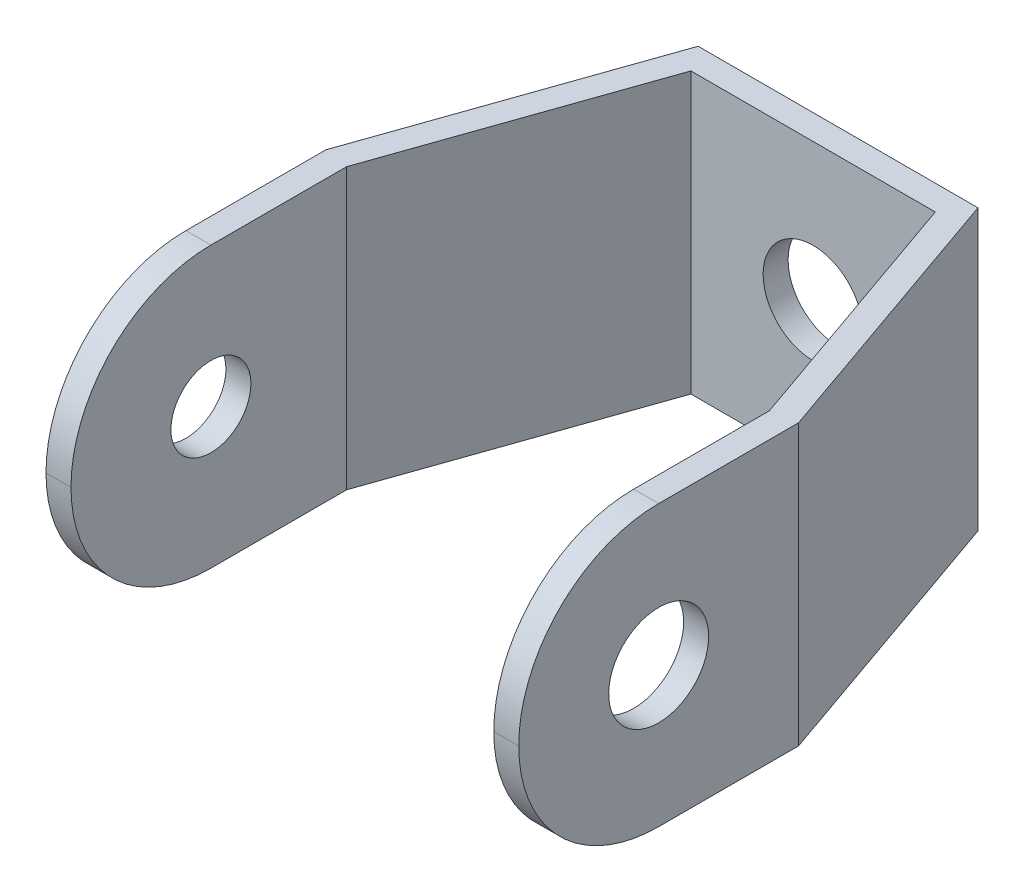
ISO-10303-21;
HEADER;
FILE_DESCRIPTION(('STEP AP214'),'2;1');
FILE_NAME('part.step','',(''),(''),'','','');
FILE_SCHEMA(('AUTOMOTIVE_DESIGN { 1 0 10303 214 1 1 1 1 }'));
ENDSEC;
DATA;
#1=APPLICATION_CONTEXT('core data for automotive mechanical design processes');
#2=APPLICATION_PROTOCOL_DEFINITION('international standard','automotive_design',2000,#1);
#3=PRODUCT_CONTEXT('',#1,'mechanical');
#4=PRODUCT('Part','Part','',(#3));
#5=PRODUCT_RELATED_PRODUCT_CATEGORY('part','',(#4));
#6=PRODUCT_DEFINITION_FORMATION('','',#4);
#7=PRODUCT_DEFINITION_CONTEXT('part definition',#1,'design');
#8=PRODUCT_DEFINITION('design','',#6,#7);
#9=PRODUCT_DEFINITION_SHAPE('','',#8);
#10=(LENGTH_UNIT() NAMED_UNIT(*) SI_UNIT(.MILLI.,.METRE.));
#11=(NAMED_UNIT(*) PLANE_ANGLE_UNIT() SI_UNIT($,.RADIAN.));
#12=(NAMED_UNIT(*) SI_UNIT($,.STERADIAN.) SOLID_ANGLE_UNIT());
#13=UNCERTAINTY_MEASURE_WITH_UNIT(LENGTH_MEASURE(1.E-05),#10,'distance_accuracy_value','');
#14=(GEOMETRIC_REPRESENTATION_CONTEXT(3) GLOBAL_UNCERTAINTY_ASSIGNED_CONTEXT((#13)) GLOBAL_UNIT_ASSIGNED_CONTEXT((#10,
#11,#12)) REPRESENTATION_CONTEXT('',''));
#15=CARTESIAN_POINT('',(0.,0.,0.));
#16=DIRECTION('',(0.,0.,1.));
#17=DIRECTION('',(1.,0.,0.));
#18=AXIS2_PLACEMENT_3D('',#15,#16,#17);
#19=CARTESIAN_POINT('',(-23.65,14.,55.6));
#20=DIRECTION('',(0.,-1.,0.));
#21=DIRECTION('',(0.,0.,-1.));
#22=AXIS2_PLACEMENT_3D('',#19,#20,#21);
#23=PLANE('',#22);
#24=DIRECTION('',(0.,0.,1.));
#25=VECTOR('',#24,1.);
#26=CARTESIAN_POINT('',(21.15,14.,0.));
#27=LINE('',#26,#25);
#28=CARTESIAN_POINT('',(21.15,14.,28.0244491600482));
#29=VERTEX_POINT('',#28);
#30=CARTESIAN_POINT('',(21.15,14.,41.6));
#31=VERTEX_POINT('',#30);
#32=EDGE_CURVE('E153',#29,#31,#27,.T.);
#33=ORIENTED_EDGE('',*,*,#32,.T.);
#34=DIRECTION('',(-1.,0.,0.));
#35=VECTOR('',#34,1.);
#36=CARTESIAN_POINT('',(23.65,14.,41.6));
#37=LINE('',#36,#35);
#38=CARTESIAN_POINT('',(23.65,14.,41.6));
#39=VERTEX_POINT('',#38);
#40=EDGE_CURVE('E11',#31,#39,#37,.F.);
#41=ORIENTED_EDGE('',*,*,#40,.T.);
#42=DIRECTION('',(0.,0.,-1.));
#43=VECTOR('',#42,1.);
#44=CARTESIAN_POINT('',(23.65,14.,55.6));
#45=LINE('',#44,#43);
#46=CARTESIAN_POINT('',(23.65,14.,27.6));
#47=VERTEX_POINT('',#46);
#48=EDGE_CURVE('E248',#39,#47,#45,.T.);
#49=ORIENTED_EDGE('',*,*,#48,.T.);
#50=DIRECTION('',(0.330045715946504,0.,0.943964949235595));
#51=VECTOR('',#50,1.);
#52=CARTESIAN_POINT('',(14.,14.,0.));
#53=LINE('',#52,#51);
#54=CARTESIAN_POINT('',(14.,14.,0.));
#55=VERTEX_POINT('',#54);
#56=EDGE_CURVE('E196',#55,#47,#53,.T.);
#57=ORIENTED_EDGE('',*,*,#56,.F.);
#58=DIRECTION('',(-1.,0.,0.));
#59=VECTOR('',#58,1.);
#60=CARTESIAN_POINT('',(-23.65,14.,0.));
#61=LINE('',#60,#59);
#62=CARTESIAN_POINT('',(-14.,14.,0.));
#63=VERTEX_POINT('',#62);
#64=EDGE_CURVE('E215',#55,#63,#61,.T.);
#65=ORIENTED_EDGE('',*,*,#64,.T.);
#66=DIRECTION('',(0.330045715946503,0.,-0.943964949235595));
#67=VECTOR('',#66,1.);
#68=CARTESIAN_POINT('',(-23.65,14.,27.6));
#69=LINE('',#68,#67);
#70=CARTESIAN_POINT('',(-23.65,14.,27.6));
#71=VERTEX_POINT('',#70);
#72=EDGE_CURVE('E207',#71,#63,#69,.T.);
#73=ORIENTED_EDGE('',*,*,#72,.F.);
#74=DIRECTION('',(0.,0.,-1.));
#75=VECTOR('',#74,1.);
#76=CARTESIAN_POINT('',(-23.65,14.,55.6));
#77=LINE('',#76,#75);
#78=CARTESIAN_POINT('',(-23.65,14.,41.6));
#79=VERTEX_POINT('',#78);
#80=EDGE_CURVE('E245',#79,#71,#77,.T.);
#81=ORIENTED_EDGE('',*,*,#80,.F.);
#82=DIRECTION('',(-1.,0.,0.));
#83=VECTOR('',#82,1.);
#84=CARTESIAN_POINT('',(-21.15,14.,41.6));
#85=LINE('',#84,#83);
#86=CARTESIAN_POINT('',(-21.15,14.,41.6));
#87=VERTEX_POINT('',#86);
#88=EDGE_CURVE('E276',#79,#87,#85,.F.);
#89=ORIENTED_EDGE('',*,*,#88,.T.);
#90=DIRECTION('',(0.,0.,-1.));
#91=VECTOR('',#90,1.);
#92=CARTESIAN_POINT('',(-21.15,14.,0.));
#93=LINE('',#92,#91);
#94=CARTESIAN_POINT('',(-21.15,14.,28.0244491600482));
#95=VERTEX_POINT('',#94);
#96=EDGE_CURVE('E164',#87,#95,#93,.T.);
#97=ORIENTED_EDGE('',*,*,#96,.T.);
#98=DIRECTION('',(0.330045715946503,0.,-0.943964949235596));
#99=VECTOR('',#98,1.);
#100=CARTESIAN_POINT('',(-10.1150651823061,14.,-3.53660793511787));
#101=LINE('',#100,#99);
#102=CARTESIAN_POINT('',(-12.2256907828092,14.,2.5));
#103=VERTEX_POINT('',#102);
#104=EDGE_CURVE('E167',#95,#103,#101,.T.);
#105=ORIENTED_EDGE('',*,*,#104,.T.);
#106=DIRECTION('',(1.,0.,0.));
#107=VECTOR('',#106,1.);
#108=CARTESIAN_POINT('',(0.,14.,2.5));
#109=LINE('',#108,#107);
#110=CARTESIAN_POINT('',(12.2256907828092,14.,2.5));
#111=VERTEX_POINT('',#110);
#112=EDGE_CURVE('E185',#103,#111,#109,.T.);
#113=ORIENTED_EDGE('',*,*,#112,.T.);
#114=DIRECTION('',(0.330045715946504,0.,0.943964949235595));
#115=VECTOR('',#114,1.);
#116=CARTESIAN_POINT('',(10.1150651823061,14.,-3.53660793511788));
#117=LINE('',#116,#115);
#118=EDGE_CURVE('E182',#111,#29,#117,.T.);
#119=ORIENTED_EDGE('',*,*,#118,.T.);
#120=EDGE_LOOP('',(#33,#41,#49,#57,#65,#73,#81,#89,#97,#105,#113,#119));
#121=FACE_BOUND('',#120,.T.);
#122=ADVANCED_FACE('F38',(#121),#23,.F.);
#123=CARTESIAN_POINT('',(-23.65,-14.,55.6));
#124=DIRECTION('',(0.,1.,0.));
#125=DIRECTION('',(0.,0.,1.));
#126=AXIS2_PLACEMENT_3D('',#123,#124,#125);
#127=PLANE('',#126);
#128=DIRECTION('',(0.,0.,-1.));
#129=VECTOR('',#128,1.);
#130=CARTESIAN_POINT('',(23.65,-14.,55.6));
#131=LINE('',#130,#129);
#132=CARTESIAN_POINT('',(23.65,-14.,41.6));
#133=VERTEX_POINT('',#132);
#134=CARTESIAN_POINT('',(23.65,-14.,27.6));
#135=VERTEX_POINT('',#134);
#136=EDGE_CURVE('E239',#133,#135,#131,.T.);
#137=ORIENTED_EDGE('',*,*,#136,.F.);
#138=DIRECTION('',(1.,0.,0.));
#139=VECTOR('',#138,1.);
#140=CARTESIAN_POINT('',(21.15,-14.,41.6));
#141=LINE('',#140,#139);
#142=CARTESIAN_POINT('',(21.15,-14.,41.6));
#143=VERTEX_POINT('',#142);
#144=EDGE_CURVE('E162',#133,#143,#141,.F.);
#145=ORIENTED_EDGE('',*,*,#144,.T.);
#146=DIRECTION('',(0.,0.,1.));
#147=VECTOR('',#146,1.);
#148=CARTESIAN_POINT('',(21.15,-14.,0.));
#149=LINE('',#148,#147);
#150=CARTESIAN_POINT('',(21.15,-14.,28.0244491600482));
#151=VERTEX_POINT('',#150);
#152=EDGE_CURVE('E150',#151,#143,#149,.T.);
#153=ORIENTED_EDGE('',*,*,#152,.F.);
#154=DIRECTION('',(0.330045715946504,0.,0.943964949235595));
#155=VECTOR('',#154,1.);
#156=CARTESIAN_POINT('',(10.1150651823061,-14.,-3.53660793511788));
#157=LINE('',#156,#155);
#158=CARTESIAN_POINT('',(12.2256907828092,-14.,2.5));
#159=VERTEX_POINT('',#158);
#160=EDGE_CURVE('E139',#159,#151,#157,.T.);
#161=ORIENTED_EDGE('',*,*,#160,.F.);
#162=DIRECTION('',(1.,0.,0.));
#163=VECTOR('',#162,1.);
#164=CARTESIAN_POINT('',(0.,-14.,2.5));
#165=LINE('',#164,#163);
#166=CARTESIAN_POINT('',(-12.2256907828092,-14.,2.5));
#167=VERTEX_POINT('',#166);
#168=EDGE_CURVE('E149',#167,#159,#165,.T.);
#169=ORIENTED_EDGE('',*,*,#168,.F.);
#170=DIRECTION('',(0.330045715946503,0.,-0.943964949235596));
#171=VECTOR('',#170,1.);
#172=CARTESIAN_POINT('',(-10.1150651823061,-14.,-3.53660793511787));
#173=LINE('',#172,#171);
#174=CARTESIAN_POINT('',(-21.15,-14.,28.0244491600482));
#175=VERTEX_POINT('',#174);
#176=EDGE_CURVE('E175',#175,#167,#173,.T.);
#177=ORIENTED_EDGE('',*,*,#176,.F.);
#178=DIRECTION('',(0.,0.,-1.));
#179=VECTOR('',#178,1.);
#180=CARTESIAN_POINT('',(-21.15,-14.,0.));
#181=LINE('',#180,#179);
#182=CARTESIAN_POINT('',(-21.15,-14.,41.6));
#183=VERTEX_POINT('',#182);
#184=EDGE_CURVE('E156',#183,#175,#181,.T.);
#185=ORIENTED_EDGE('',*,*,#184,.F.);
#186=DIRECTION('',(1.,0.,0.));
#187=VECTOR('',#186,1.);
#188=CARTESIAN_POINT('',(-23.65,-14.,41.6));
#189=LINE('',#188,#187);
#190=CARTESIAN_POINT('',(-23.65,-14.,41.6));
#191=VERTEX_POINT('',#190);
#192=EDGE_CURVE('E266',#183,#191,#189,.F.);
#193=ORIENTED_EDGE('',*,*,#192,.T.);
#194=DIRECTION('',(0.,0.,-1.));
#195=VECTOR('',#194,1.);
#196=CARTESIAN_POINT('',(-23.65,-14.,55.6));
#197=LINE('',#196,#195);
#198=CARTESIAN_POINT('',(-23.65,-14.,27.6));
#199=VERTEX_POINT('',#198);
#200=EDGE_CURVE('E242',#191,#199,#197,.T.);
#201=ORIENTED_EDGE('',*,*,#200,.T.);
#202=DIRECTION('',(0.330045715946503,0.,-0.943964949235595));
#203=VECTOR('',#202,1.);
#204=CARTESIAN_POINT('',(-23.65,-14.,27.6));
#205=LINE('',#204,#203);
#206=CARTESIAN_POINT('',(-14.,-14.,0.));
#207=VERTEX_POINT('',#206);
#208=EDGE_CURVE('E202',#199,#207,#205,.T.);
#209=ORIENTED_EDGE('',*,*,#208,.T.);
#210=DIRECTION('',(1.,0.,0.));
#211=VECTOR('',#210,1.);
#212=CARTESIAN_POINT('',(-23.65,-14.,0.));
#213=LINE('',#212,#211);
#214=CARTESIAN_POINT('',(14.,-14.,0.));
#215=VERTEX_POINT('',#214);
#216=EDGE_CURVE('E235',#207,#215,#213,.T.);
#217=ORIENTED_EDGE('',*,*,#216,.T.);
#218=DIRECTION('',(0.330045715946504,0.,0.943964949235595));
#219=VECTOR('',#218,1.);
#220=CARTESIAN_POINT('',(14.,-14.,0.));
#221=LINE('',#220,#219);
#222=EDGE_CURVE('E219',#215,#135,#221,.T.);
#223=ORIENTED_EDGE('',*,*,#222,.T.);
#224=EDGE_LOOP('',(#137,#145,#153,#161,#169,#177,#185,#193,#201,#209,#217,#223));
#225=FACE_BOUND('',#224,.T.);
#226=ADVANCED_FACE('F160',(#225),#127,.F.);
#227=CARTESIAN_POINT('',(23.65,14.,55.6));
#228=DIRECTION('',(-1.,0.,0.));
#229=DIRECTION('',(0.,-1.,0.));
#230=AXIS2_PLACEMENT_3D('',#227,#228,#229);
#231=PLANE('',#230);
#232=CARTESIAN_POINT('',(23.65,0.,41.6));
#233=DIRECTION('',(-1.,0.,0.));
#234=DIRECTION('',(0.,-1.,0.));
#235=AXIS2_PLACEMENT_3D('',#232,#233,#234);
#236=CIRCLE('',#235,5.);
#237=CARTESIAN_POINT('',(23.65,-5.,41.6));
#238=VERTEX_POINT('',#237);
#239=EDGE_CURVE('E170',#238,#238,#236,.F.);
#240=ORIENTED_EDGE('',*,*,#239,.F.);
#241=EDGE_LOOP('',(#240));
#242=FACE_BOUND('',#241,.T.);
#243=CARTESIAN_POINT('',(23.65,0.,41.6));
#244=DIRECTION('',(-1.,0.,0.));
#245=DIRECTION('',(0.,-1.,0.));
#246=AXIS2_PLACEMENT_3D('',#243,#244,#245);
#247=CIRCLE('',#246,14.);
#248=CARTESIAN_POINT('',(23.65,0.,55.6));
#249=VERTEX_POINT('',#248);
#250=EDGE_CURVE('E279',#39,#249,#247,.F.);
#251=ORIENTED_EDGE('',*,*,#250,.T.);
#252=CARTESIAN_POINT('',(23.65,0.,41.6));
#253=DIRECTION('',(-1.,0.,0.));
#254=DIRECTION('',(0.,-1.,0.));
#255=AXIS2_PLACEMENT_3D('',#252,#253,#254);
#256=CIRCLE('',#255,14.);
#257=EDGE_CURVE('E287',#249,#133,#256,.F.);
#258=ORIENTED_EDGE('',*,*,#257,.T.);
#259=ORIENTED_EDGE('',*,*,#136,.T.);
#260=DIRECTION('',(0.,1.,0.));
#261=VECTOR('',#260,1.);
#262=CARTESIAN_POINT('',(23.65,-14.,27.6));
#263=LINE('',#262,#261);
#264=EDGE_CURVE('E210',#135,#47,#263,.T.);
#265=ORIENTED_EDGE('',*,*,#264,.T.);
#266=ORIENTED_EDGE('',*,*,#48,.F.);
#267=EDGE_LOOP('',(#251,#258,#259,#265,#266));
#268=FACE_BOUND('',#267,.T.);
#269=ADVANCED_FACE('F320',(#242,#268),#231,.F.);
#270=CARTESIAN_POINT('',(-23.65,14.,55.6));
#271=DIRECTION('',(1.,0.,0.));
#272=DIRECTION('',(0.,1.,0.));
#273=AXIS2_PLACEMENT_3D('',#270,#271,#272);
#274=PLANE('',#273);
#275=CARTESIAN_POINT('',(-23.65,0.,41.6));
#276=DIRECTION('',(-1.,0.,0.));
#277=DIRECTION('',(0.,-1.,0.));
#278=AXIS2_PLACEMENT_3D('',#275,#276,#277);
#279=CIRCLE('',#278,4.);
#280=CARTESIAN_POINT('',(-23.65,-4.,41.6));
#281=VERTEX_POINT('',#280);
#282=EDGE_CURVE('E260',#281,#281,#279,.T.);
#283=ORIENTED_EDGE('',*,*,#282,.F.);
#284=EDGE_LOOP('',(#283));
#285=FACE_BOUND('',#284,.T.);
#286=ORIENTED_EDGE('',*,*,#200,.F.);
#287=CARTESIAN_POINT('',(-23.65,0.,41.6));
#288=DIRECTION('',(1.,0.,0.));
#289=DIRECTION('',(0.,1.,0.));
#290=AXIS2_PLACEMENT_3D('',#287,#288,#289);
#291=CIRCLE('',#290,14.);
#292=CARTESIAN_POINT('',(-23.65,0.,55.6));
#293=VERTEX_POINT('',#292);
#294=EDGE_CURVE('E273',#191,#293,#291,.F.);
#295=ORIENTED_EDGE('',*,*,#294,.T.);
#296=CARTESIAN_POINT('',(-23.65,0.,41.6));
#297=DIRECTION('',(1.,0.,0.));
#298=DIRECTION('',(0.,1.,0.));
#299=AXIS2_PLACEMENT_3D('',#296,#297,#298);
#300=CIRCLE('',#299,14.);
#301=EDGE_CURVE('E270',#293,#79,#300,.F.);
#302=ORIENTED_EDGE('',*,*,#301,.T.);
#303=ORIENTED_EDGE('',*,*,#80,.T.);
#304=DIRECTION('',(0.,1.,0.));
#305=VECTOR('',#304,1.);
#306=CARTESIAN_POINT('',(-23.65,-14.,27.6));
#307=LINE('',#306,#305);
#308=EDGE_CURVE('E211',#199,#71,#307,.T.);
#309=ORIENTED_EDGE('',*,*,#308,.F.);
#310=EDGE_LOOP('',(#286,#295,#302,#303,#309));
#311=FACE_BOUND('',#310,.T.);
#312=ADVANCED_FACE('F316',(#285,#311),#274,.F.);
#313=CARTESIAN_POINT('',(0.,0.,0.));
#314=DIRECTION('',(0.,0.,1.));
#315=DIRECTION('',(1.,0.,0.));
#316=AXIS2_PLACEMENT_3D('',#313,#314,#315);
#317=PLANE('',#316);
#318=CARTESIAN_POINT('',(0.,0.,0.));
#319=DIRECTION('',(0.,0.,-1.));
#320=DIRECTION('',(-1.,0.,0.));
#321=AXIS2_PLACEMENT_3D('',#318,#319,#320);
#322=CIRCLE('',#321,5.);
#323=CARTESIAN_POINT('',(-5.,0.,0.));
#324=VERTEX_POINT('',#323);
#325=EDGE_CURVE('E302',#324,#324,#322,.T.);
#326=ORIENTED_EDGE('',*,*,#325,.F.);
#327=EDGE_LOOP('',(#326));
#328=FACE_BOUND('',#327,.T.);
#329=ORIENTED_EDGE('',*,*,#216,.F.);
#330=DIRECTION('',(0.,1.,0.));
#331=VECTOR('',#330,1.);
#332=CARTESIAN_POINT('',(-14.,-14.,0.));
#333=LINE('',#332,#331);
#334=EDGE_CURVE('E206',#207,#63,#333,.T.);
#335=ORIENTED_EDGE('',*,*,#334,.T.);
#336=ORIENTED_EDGE('',*,*,#64,.F.);
#337=DIRECTION('',(0.,1.,0.));
#338=VECTOR('',#337,1.);
#339=CARTESIAN_POINT('',(14.,-14.,0.));
#340=LINE('',#339,#338);
#341=EDGE_CURVE('E223',#215,#55,#340,.T.);
#342=ORIENTED_EDGE('',*,*,#341,.F.);
#343=EDGE_LOOP('',(#329,#335,#336,#342));
#344=FACE_BOUND('',#343,.T.);
#345=ADVANCED_FACE('F319',(#328,#344),#317,.F.);
#346=CARTESIAN_POINT('',(14.,-14.,0.));
#347=DIRECTION('',(-0.943964949235595,0.,0.330045715946504));
#348=DIRECTION('',(0.330045715946504,0.,0.943964949235595));
#349=AXIS2_PLACEMENT_3D('',#346,#347,#348);
#350=PLANE('',#349);
#351=ORIENTED_EDGE('',*,*,#56,.T.);
#352=ORIENTED_EDGE('',*,*,#264,.F.);
#353=ORIENTED_EDGE('',*,*,#222,.F.);
#354=ORIENTED_EDGE('',*,*,#341,.T.);
#355=EDGE_LOOP('',(#351,#352,#353,#354));
#356=FACE_BOUND('',#355,.T.);
#357=ADVANCED_FACE('F341',(#356),#350,.F.);
#358=CARTESIAN_POINT('',(-23.65,-14.,27.6));
#359=DIRECTION('',(0.943964949235595,0.,0.330045715946503));
#360=DIRECTION('',(0.330045715946503,0.,-0.943964949235596));
#361=AXIS2_PLACEMENT_3D('',#358,#359,#360);
#362=PLANE('',#361);
#363=ORIENTED_EDGE('',*,*,#72,.T.);
#364=ORIENTED_EDGE('',*,*,#334,.F.);
#365=ORIENTED_EDGE('',*,*,#208,.F.);
#366=ORIENTED_EDGE('',*,*,#308,.T.);
#367=EDGE_LOOP('',(#363,#364,#365,#366));
#368=FACE_BOUND('',#367,.T.);
#369=ADVANCED_FACE('F330',(#368),#362,.F.);
#370=CARTESIAN_POINT('',(21.15,-14.,0.));
#371=DIRECTION('',(-1.,0.,0.));
#372=DIRECTION('',(0.,0.,1.));
#373=AXIS2_PLACEMENT_3D('',#370,#371,#372);
#374=PLANE('',#373);
#375=CARTESIAN_POINT('',(21.15,0.,41.6));
#376=DIRECTION('',(-1.,0.,0.));
#377=DIRECTION('',(0.,0.,1.));
#378=AXIS2_PLACEMENT_3D('',#375,#376,#377);
#379=CIRCLE('',#378,5.);
#380=CARTESIAN_POINT('',(21.15,-5.,41.6));
#381=VERTEX_POINT('',#380);
#382=EDGE_CURVE('E252',#381,#381,#379,.F.);
#383=ORIENTED_EDGE('',*,*,#382,.T.);
#384=EDGE_LOOP('',(#383));
#385=FACE_BOUND('',#384,.T.);
#386=ORIENTED_EDGE('',*,*,#152,.T.);
#387=CARTESIAN_POINT('',(21.15,0.,41.6));
#388=DIRECTION('',(-1.,0.,0.));
#389=DIRECTION('',(0.,0.,1.));
#390=AXIS2_PLACEMENT_3D('',#387,#388,#389);
#391=CIRCLE('',#390,14.);
#392=CARTESIAN_POINT('',(21.15,0.,55.6));
#393=VERTEX_POINT('',#392);
#394=EDGE_CURVE('E48',#143,#393,#391,.T.);
#395=ORIENTED_EDGE('',*,*,#394,.T.);
#396=CARTESIAN_POINT('',(21.15,0.,41.6));
#397=DIRECTION('',(-1.,0.,0.));
#398=DIRECTION('',(0.,0.,1.));
#399=AXIS2_PLACEMENT_3D('',#396,#397,#398);
#400=CIRCLE('',#399,14.);
#401=EDGE_CURVE('E59',#393,#31,#400,.T.);
#402=ORIENTED_EDGE('',*,*,#401,.T.);
#403=ORIENTED_EDGE('',*,*,#32,.F.);
#404=DIRECTION('',(0.,1.,0.));
#405=VECTOR('',#404,1.);
#406=CARTESIAN_POINT('',(21.15,-14.,28.0244491600482));
#407=LINE('',#406,#405);
#408=EDGE_CURVE('E143',#151,#29,#407,.T.);
#409=ORIENTED_EDGE('',*,*,#408,.F.);
#410=EDGE_LOOP('',(#386,#395,#402,#403,#409));
#411=FACE_BOUND('',#410,.T.);
#412=ADVANCED_FACE('F152',(#385,#411),#374,.T.);
#413=CARTESIAN_POINT('',(-21.15,-14.,0.));
#414=DIRECTION('',(1.,0.,0.));
#415=DIRECTION('',(0.,0.,-1.));
#416=AXIS2_PLACEMENT_3D('',#413,#414,#415);
#417=PLANE('',#416);
#418=CARTESIAN_POINT('',(-21.15,0.,41.6));
#419=DIRECTION('',(1.,0.,0.));
#420=DIRECTION('',(0.,0.,-1.));
#421=AXIS2_PLACEMENT_3D('',#418,#419,#420);
#422=CIRCLE('',#421,4.);
#423=CARTESIAN_POINT('',(-21.15,-4.,41.6));
#424=VERTEX_POINT('',#423);
#425=EDGE_CURVE('E256',#424,#424,#422,.T.);
#426=ORIENTED_EDGE('',*,*,#425,.F.);
#427=EDGE_LOOP('',(#426));
#428=FACE_BOUND('',#427,.T.);
#429=CARTESIAN_POINT('',(-21.15,0.,41.6));
#430=DIRECTION('',(1.,0.,0.));
#431=DIRECTION('',(0.,0.,-1.));
#432=AXIS2_PLACEMENT_3D('',#429,#430,#431);
#433=CIRCLE('',#432,14.);
#434=CARTESIAN_POINT('',(-21.15,0.,55.6));
#435=VERTEX_POINT('',#434);
#436=EDGE_CURVE('E251',#87,#435,#433,.T.);
#437=ORIENTED_EDGE('',*,*,#436,.T.);
#438=CARTESIAN_POINT('',(-21.15,0.,41.6));
#439=DIRECTION('',(1.,0.,0.));
#440=DIRECTION('',(0.,0.,-1.));
#441=AXIS2_PLACEMENT_3D('',#438,#439,#440);
#442=CIRCLE('',#441,14.);
#443=EDGE_CURVE('E263',#435,#183,#442,.T.);
#444=ORIENTED_EDGE('',*,*,#443,.T.);
#445=ORIENTED_EDGE('',*,*,#184,.T.);
#446=DIRECTION('',(0.,1.,0.));
#447=VECTOR('',#446,1.);
#448=CARTESIAN_POINT('',(-21.15,-14.,28.0244491600482));
#449=LINE('',#448,#447);
#450=EDGE_CURVE('E192',#175,#95,#449,.T.);
#451=ORIENTED_EDGE('',*,*,#450,.T.);
#452=ORIENTED_EDGE('',*,*,#96,.F.);
#453=EDGE_LOOP('',(#437,#444,#445,#451,#452));
#454=FACE_BOUND('',#453,.T.);
#455=ADVANCED_FACE('F381',(#428,#454),#417,.T.);
#456=CARTESIAN_POINT('',(-10.1150651823061,-14.,-3.53660793511787));
#457=DIRECTION('',(0.943964949235595,0.,0.330045715946503));
#458=DIRECTION('',(0.330045715946503,0.,-0.943964949235595));
#459=AXIS2_PLACEMENT_3D('',#456,#457,#458);
#460=PLANE('',#459);
#461=ORIENTED_EDGE('',*,*,#104,.F.);
#462=ORIENTED_EDGE('',*,*,#450,.F.);
#463=ORIENTED_EDGE('',*,*,#176,.T.);
#464=DIRECTION('',(0.,1.,0.));
#465=VECTOR('',#464,1.);
#466=CARTESIAN_POINT('',(-12.2256907828092,-14.,2.5));
#467=LINE('',#466,#465);
#468=EDGE_CURVE('E197',#167,#103,#467,.T.);
#469=ORIENTED_EDGE('',*,*,#468,.T.);
#470=EDGE_LOOP('',(#461,#462,#463,#469));
#471=FACE_BOUND('',#470,.T.);
#472=ADVANCED_FACE('F386',(#471),#460,.T.);
#473=CARTESIAN_POINT('',(0.,-14.,2.5));
#474=DIRECTION('',(0.,0.,1.));
#475=DIRECTION('',(1.,0.,0.));
#476=AXIS2_PLACEMENT_3D('',#473,#474,#475);
#477=PLANE('',#476);
#478=CARTESIAN_POINT('',(0.,0.,2.5));
#479=DIRECTION('',(0.,0.,1.));
#480=DIRECTION('',(1.,0.,0.));
#481=AXIS2_PLACEMENT_3D('',#478,#479,#480);
#482=CIRCLE('',#481,5.);
#483=CARTESIAN_POINT('',(-5.,0.,2.5));
#484=VERTEX_POINT('',#483);
#485=EDGE_CURVE('E42',#484,#484,#482,.T.);
#486=ORIENTED_EDGE('',*,*,#485,.F.);
#487=EDGE_LOOP('',(#486));
#488=FACE_BOUND('',#487,.T.);
#489=ORIENTED_EDGE('',*,*,#112,.F.);
#490=ORIENTED_EDGE('',*,*,#468,.F.);
#491=ORIENTED_EDGE('',*,*,#168,.T.);
#492=DIRECTION('',(0.,1.,0.));
#493=VECTOR('',#492,1.);
#494=CARTESIAN_POINT('',(12.2256907828092,-14.,2.5));
#495=LINE('',#494,#493);
#496=EDGE_CURVE('E144',#159,#111,#495,.T.);
#497=ORIENTED_EDGE('',*,*,#496,.T.);
#498=EDGE_LOOP('',(#489,#490,#491,#497));
#499=FACE_BOUND('',#498,.T.);
#500=ADVANCED_FACE('F390',(#488,#499),#477,.T.);
#501=CARTESIAN_POINT('',(10.1150651823061,-14.,-3.53660793511788));
#502=DIRECTION('',(-0.943964949235595,0.,0.330045715946504));
#503=DIRECTION('',(0.330045715946504,0.,0.943964949235595));
#504=AXIS2_PLACEMENT_3D('',#501,#502,#503);
#505=PLANE('',#504);
#506=ORIENTED_EDGE('',*,*,#118,.F.);
#507=ORIENTED_EDGE('',*,*,#496,.F.);
#508=ORIENTED_EDGE('',*,*,#160,.T.);
#509=ORIENTED_EDGE('',*,*,#408,.T.);
#510=EDGE_LOOP('',(#506,#507,#508,#509));
#511=FACE_BOUND('',#510,.T.);
#512=ADVANCED_FACE('F142',(#511),#505,.T.);
#513=CARTESIAN_POINT('',(23.650012,0.,41.6));
#514=DIRECTION('',(-1.,0.,0.));
#515=DIRECTION('',(0.,-1.,0.));
#516=AXIS2_PLACEMENT_3D('',#513,#514,#515);
#517=CYLINDRICAL_SURFACE('',#516,5.);
#518=CARTESIAN_POINT('',(21.15,-5.,41.6));
#519=CARTESIAN_POINT('',(21.1760416666667,-5.,41.6));
#520=CARTESIAN_POINT('',(21.2020833333333,-5.,41.6));
#521=CARTESIAN_POINT('',(21.2541666666667,-5.,41.6));
#522=CARTESIAN_POINT('',(21.2802083333333,-5.,41.6));
#523=CARTESIAN_POINT('',(21.3322916666667,-5.,41.6));
#524=CARTESIAN_POINT('',(21.3583333333333,-5.,41.6));
#525=CARTESIAN_POINT('',(21.4104166666667,-5.,41.6));
#526=CARTESIAN_POINT('',(21.4364583333333,-5.,41.6));
#527=CARTESIAN_POINT('',(21.4885416666667,-5.,41.6));
#528=CARTESIAN_POINT('',(21.5145833333333,-5.,41.6));
#529=CARTESIAN_POINT('',(21.5666666666667,-5.,41.6));
#530=CARTESIAN_POINT('',(21.5927083333333,-5.,41.6));
#531=CARTESIAN_POINT('',(21.6447916666667,-5.,41.6));
#532=CARTESIAN_POINT('',(21.6708333333333,-5.,41.6));
#533=CARTESIAN_POINT('',(21.7229166666667,-5.,41.6));
#534=CARTESIAN_POINT('',(21.7489583333333,-5.,41.6));
#535=CARTESIAN_POINT('',(21.8010416666667,-5.,41.6));
#536=CARTESIAN_POINT('',(21.8270833333333,-5.,41.6));
#537=CARTESIAN_POINT('',(21.8791666666667,-5.,41.6));
#538=CARTESIAN_POINT('',(21.9052083333333,-5.,41.6));
#539=CARTESIAN_POINT('',(21.9572916666667,-5.,41.6));
#540=CARTESIAN_POINT('',(21.9833333333333,-5.,41.6));
#541=CARTESIAN_POINT('',(22.0354166666667,-5.,41.6));
#542=CARTESIAN_POINT('',(22.0614583333333,-5.,41.6));
#543=CARTESIAN_POINT('',(22.1135416666667,-5.,41.6));
#544=CARTESIAN_POINT('',(22.1395833333333,-5.,41.6));
#545=CARTESIAN_POINT('',(22.1916666666667,-5.,41.6));
#546=CARTESIAN_POINT('',(22.2177083333333,-5.,41.6));
#547=CARTESIAN_POINT('',(22.2697916666667,-5.,41.6));
#548=CARTESIAN_POINT('',(22.2958333333333,-5.,41.6));
#549=CARTESIAN_POINT('',(22.3479166666667,-5.,41.6));
#550=CARTESIAN_POINT('',(22.3739583333333,-5.,41.6));
#551=CARTESIAN_POINT('',(22.4260416666667,-5.,41.6));
#552=CARTESIAN_POINT('',(22.4520833333333,-5.,41.6));
#553=CARTESIAN_POINT('',(22.5041666666667,-5.,41.6));
#554=CARTESIAN_POINT('',(22.5302083333333,-5.,41.6));
#555=CARTESIAN_POINT('',(22.5822916666667,-5.,41.6));
#556=CARTESIAN_POINT('',(22.6083333333333,-5.,41.6));
#557=CARTESIAN_POINT('',(22.6604166666667,-5.,41.6));
#558=CARTESIAN_POINT('',(22.6864583333333,-5.,41.6));
#559=CARTESIAN_POINT('',(22.7385416666667,-5.,41.6));
#560=CARTESIAN_POINT('',(22.7645833333333,-5.,41.6));
#561=CARTESIAN_POINT('',(22.8166666666667,-5.,41.6));
#562=CARTESIAN_POINT('',(22.8427083333333,-5.,41.6));
#563=CARTESIAN_POINT('',(22.8947916666667,-5.,41.6));
#564=CARTESIAN_POINT('',(22.9208333333333,-5.,41.6));
#565=CARTESIAN_POINT('',(22.9729166666667,-5.,41.6));
#566=CARTESIAN_POINT('',(22.9989583333333,-5.,41.6));
#567=CARTESIAN_POINT('',(23.0510416666667,-5.,41.6));
#568=CARTESIAN_POINT('',(23.0770833333333,-5.,41.6));
#569=CARTESIAN_POINT('',(23.1291666666667,-5.,41.6));
#570=CARTESIAN_POINT('',(23.1552083333333,-5.,41.6));
#571=CARTESIAN_POINT('',(23.2072916666667,-5.,41.6));
#572=CARTESIAN_POINT('',(23.2333333333333,-5.,41.6));
#573=CARTESIAN_POINT('',(23.2854166666667,-5.,41.6));
#574=CARTESIAN_POINT('',(23.3114583333333,-5.,41.6));
#575=CARTESIAN_POINT('',(23.3635416666667,-5.,41.6));
#576=CARTESIAN_POINT('',(23.3895833333333,-5.,41.6));
#577=CARTESIAN_POINT('',(23.4416666666667,-5.,41.6));
#578=CARTESIAN_POINT('',(23.4677083333333,-5.,41.6));
#579=CARTESIAN_POINT('',(23.5197916666667,-5.,41.6));
#580=CARTESIAN_POINT('',(23.5458333333333,-5.,41.6));
#581=CARTESIAN_POINT('',(23.5979166666667,-5.,41.6));
#582=CARTESIAN_POINT('',(23.6239583333333,-5.,41.6));
#583=CARTESIAN_POINT('',(23.65,-5.,41.6));
#584=B_SPLINE_CURVE_WITH_KNOTS('',3,(#518,#519,#520,#521,#522,#523,#524,#525,#526,#527,#528,
#529,#530,#531,#532,#533,#534,#535,#536,#537,#538,#539,#540,#541,#542,#543,#544,#545,#546,#547,
#548,#549,#550,#551,#552,#553,#554,#555,#556,#557,#558,#559,#560,#561,#562,#563,#564,#565,#566,
#567,#568,#569,#570,#571,#572,#573,#574,#575,#576,#577,#578,#579,#580,#581,#582,#583),
.UNSPECIFIED.,.F.,.F.,(4,2,2,2,2,2,2,2,2,2,2,2,2,2,2,2,2,2,2,2,2,2,2,2,2,2,2,2,2,2,2,2,4),(0.,
0.0781249999999983,0.15625,0.234374999999998,0.3125,0.390624999999999,0.46875,0.546874999999999,
0.625000000000001,0.703124999999999,0.781250000000001,0.859374999999999,0.937500000000001,
1.015625,1.09375,1.171875,1.25,1.328125,1.40625,1.484375,1.5625,1.640625,1.71875,1.796875,1.875,
1.953125,2.03125,2.109375,2.1875,2.265625,2.34375,2.421875,2.5),.UNSPECIFIED.);
#585=EDGE_CURVE('BSEAM373',#381,#238,#584,.T.);
#586=ORIENTED_EDGE('',*,*,#382,.F.);
#587=ORIENTED_EDGE('',*,*,#239,.T.);
#588=ORIENTED_EDGE('',*,*,#585,.T.);
#589=ORIENTED_EDGE('',*,*,#585,.F.);
#590=EDGE_LOOP('',(#586,#588,#587,#589));
#591=FACE_BOUND('',#590,.T.);
#592=ADVANCED_FACE('F373',(#591),#517,.F.);
#593=CARTESIAN_POINT('',(-18.05,0.,41.6));
#594=DIRECTION('',(-1.,0.,0.));
#595=DIRECTION('',(0.,-1.,0.));
#596=AXIS2_PLACEMENT_3D('',#593,#594,#595);
#597=CYLINDRICAL_SURFACE('',#596,4.);
#598=CARTESIAN_POINT('',(-21.15,-4.,41.6));
#599=CARTESIAN_POINT('',(-21.1760416666667,-4.,41.6));
#600=CARTESIAN_POINT('',(-21.2020833333333,-4.,41.6));
#601=CARTESIAN_POINT('',(-21.2541666666667,-4.,41.6));
#602=CARTESIAN_POINT('',(-21.2802083333333,-4.,41.6));
#603=CARTESIAN_POINT('',(-21.3322916666667,-4.,41.6));
#604=CARTESIAN_POINT('',(-21.3583333333333,-4.,41.6));
#605=CARTESIAN_POINT('',(-21.4104166666667,-4.,41.6));
#606=CARTESIAN_POINT('',(-21.4364583333333,-4.,41.6));
#607=CARTESIAN_POINT('',(-21.4885416666667,-4.,41.6));
#608=CARTESIAN_POINT('',(-21.5145833333333,-4.,41.6));
#609=CARTESIAN_POINT('',(-21.5666666666667,-4.,41.6));
#610=CARTESIAN_POINT('',(-21.5927083333333,-4.,41.6));
#611=CARTESIAN_POINT('',(-21.6447916666667,-4.,41.6));
#612=CARTESIAN_POINT('',(-21.6708333333333,-4.,41.6));
#613=CARTESIAN_POINT('',(-21.7229166666667,-4.,41.6));
#614=CARTESIAN_POINT('',(-21.7489583333333,-4.,41.6));
#615=CARTESIAN_POINT('',(-21.8010416666667,-4.,41.6));
#616=CARTESIAN_POINT('',(-21.8270833333333,-4.,41.6));
#617=CARTESIAN_POINT('',(-21.8791666666667,-4.,41.6));
#618=CARTESIAN_POINT('',(-21.9052083333333,-4.,41.6));
#619=CARTESIAN_POINT('',(-21.9572916666667,-4.,41.6));
#620=CARTESIAN_POINT('',(-21.9833333333333,-4.,41.6));
#621=CARTESIAN_POINT('',(-22.0354166666667,-4.,41.6));
#622=CARTESIAN_POINT('',(-22.0614583333333,-4.,41.6));
#623=CARTESIAN_POINT('',(-22.1135416666667,-4.,41.6));
#624=CARTESIAN_POINT('',(-22.1395833333333,-4.,41.6));
#625=CARTESIAN_POINT('',(-22.1916666666667,-4.,41.6));
#626=CARTESIAN_POINT('',(-22.2177083333333,-4.,41.6));
#627=CARTESIAN_POINT('',(-22.2697916666667,-4.,41.6));
#628=CARTESIAN_POINT('',(-22.2958333333333,-4.,41.6));
#629=CARTESIAN_POINT('',(-22.3479166666667,-4.,41.6));
#630=CARTESIAN_POINT('',(-22.3739583333333,-4.,41.6));
#631=CARTESIAN_POINT('',(-22.4260416666667,-4.,41.6));
#632=CARTESIAN_POINT('',(-22.4520833333333,-4.,41.6));
#633=CARTESIAN_POINT('',(-22.5041666666667,-4.,41.6));
#634=CARTESIAN_POINT('',(-22.5302083333333,-4.,41.6));
#635=CARTESIAN_POINT('',(-22.5822916666667,-4.,41.6));
#636=CARTESIAN_POINT('',(-22.6083333333333,-4.,41.6));
#637=CARTESIAN_POINT('',(-22.6604166666667,-4.,41.6));
#638=CARTESIAN_POINT('',(-22.6864583333333,-4.,41.6));
#639=CARTESIAN_POINT('',(-22.7385416666667,-4.,41.6));
#640=CARTESIAN_POINT('',(-22.7645833333333,-4.,41.6));
#641=CARTESIAN_POINT('',(-22.8166666666667,-4.,41.6));
#642=CARTESIAN_POINT('',(-22.8427083333333,-4.,41.6));
#643=CARTESIAN_POINT('',(-22.8947916666667,-4.,41.6));
#644=CARTESIAN_POINT('',(-22.9208333333333,-4.,41.6));
#645=CARTESIAN_POINT('',(-22.9729166666667,-4.,41.6));
#646=CARTESIAN_POINT('',(-22.9989583333333,-4.,41.6));
#647=CARTESIAN_POINT('',(-23.0510416666667,-4.,41.6));
#648=CARTESIAN_POINT('',(-23.0770833333333,-4.,41.6));
#649=CARTESIAN_POINT('',(-23.1291666666667,-4.,41.6));
#650=CARTESIAN_POINT('',(-23.1552083333333,-4.,41.6));
#651=CARTESIAN_POINT('',(-23.2072916666667,-4.,41.6));
#652=CARTESIAN_POINT('',(-23.2333333333333,-4.,41.6));
#653=CARTESIAN_POINT('',(-23.2854166666667,-4.,41.6));
#654=CARTESIAN_POINT('',(-23.3114583333333,-4.,41.6));
#655=CARTESIAN_POINT('',(-23.3635416666667,-4.,41.6));
#656=CARTESIAN_POINT('',(-23.3895833333333,-4.,41.6));
#657=CARTESIAN_POINT('',(-23.4416666666667,-4.,41.6));
#658=CARTESIAN_POINT('',(-23.4677083333333,-4.,41.6));
#659=CARTESIAN_POINT('',(-23.5197916666667,-4.,41.6));
#660=CARTESIAN_POINT('',(-23.5458333333333,-4.,41.6));
#661=CARTESIAN_POINT('',(-23.5979166666667,-4.,41.6));
#662=CARTESIAN_POINT('',(-23.6239583333333,-4.,41.6));
#663=CARTESIAN_POINT('',(-23.65,-4.,41.6));
#664=B_SPLINE_CURVE_WITH_KNOTS('',3,(#598,#599,#600,#601,#602,#603,#604,#605,#606,#607,#608,
#609,#610,#611,#612,#613,#614,#615,#616,#617,#618,#619,#620,#621,#622,#623,#624,#625,#626,#627,
#628,#629,#630,#631,#632,#633,#634,#635,#636,#637,#638,#639,#640,#641,#642,#643,#644,#645,#646,
#647,#648,#649,#650,#651,#652,#653,#654,#655,#656,#657,#658,#659,#660,#661,#662,#663),
.UNSPECIFIED.,.F.,.F.,(4,2,2,2,2,2,2,2,2,2,2,2,2,2,2,2,2,2,2,2,2,2,2,2,2,2,2,2,2,2,2,2,4),(0.,
0.0781249999999983,0.15625,0.234374999999998,0.312499999999997,0.390624999999999,
0.468749999999997,0.546874999999999,0.624999999999997,0.703124999999999,0.781249999999997,
0.859374999999999,0.937499999999997,1.015625,1.09375,1.171875,1.25,1.328125,1.40624999999999,
1.484375,1.56249999999999,1.640625,1.71874999999999,1.796875,1.87499999999999,1.953125,
2.03124999999999,2.10937499999999,2.1875,2.26562499999999,2.34375,2.42187499999999,2.5),.UNSPECIFIED.);
#665=EDGE_CURVE('BSEAM314',#424,#281,#664,.T.);
#666=ORIENTED_EDGE('',*,*,#425,.T.);
#667=ORIENTED_EDGE('',*,*,#282,.T.);
#668=ORIENTED_EDGE('',*,*,#665,.T.);
#669=ORIENTED_EDGE('',*,*,#665,.F.);
#670=EDGE_LOOP('',(#666,#668,#667,#669));
#671=FACE_BOUND('',#670,.T.);
#672=ADVANCED_FACE('F314',(#671),#597,.F.);
#673=CARTESIAN_POINT('',(0.,0.,41.6));
#674=DIRECTION('',(1.,0.,0.));
#675=DIRECTION('',(0.,0.,-1.));
#676=AXIS2_PLACEMENT_3D('',#673,#674,#675);
#677=CYLINDRICAL_SURFACE('',#676,14.);
#678=ORIENTED_EDGE('',*,*,#88,.F.);
#679=ORIENTED_EDGE('',*,*,#301,.F.);
#680=DIRECTION('',(-1.,0.,0.));
#681=VECTOR('',#680,1.);
#682=CARTESIAN_POINT('',(-23.65,0.,55.6));
#683=LINE('',#682,#681);
#684=EDGE_CURVE('E280',#435,#293,#683,.T.);
#685=ORIENTED_EDGE('',*,*,#684,.F.);
#686=ORIENTED_EDGE('',*,*,#436,.F.);
#687=EDGE_LOOP('',(#678,#679,#685,#686));
#688=FACE_BOUND('',#687,.T.);
#689=ADVANCED_FACE('F366',(#688),#677,.T.);
#690=CARTESIAN_POINT('',(0.,0.,41.6));
#691=DIRECTION('',(-1.,0.,0.));
#692=DIRECTION('',(0.,0.,1.));
#693=AXIS2_PLACEMENT_3D('',#690,#691,#692);
#694=CYLINDRICAL_SURFACE('',#693,14.);
#695=ORIENTED_EDGE('',*,*,#294,.F.);
#696=ORIENTED_EDGE('',*,*,#192,.F.);
#697=ORIENTED_EDGE('',*,*,#443,.F.);
#698=ORIENTED_EDGE('',*,*,#684,.T.);
#699=EDGE_LOOP('',(#695,#696,#697,#698));
#700=FACE_BOUND('',#699,.T.);
#701=ADVANCED_FACE('F352',(#700),#694,.T.);
#702=CARTESIAN_POINT('',(0.,0.,41.6));
#703=DIRECTION('',(1.,0.,0.));
#704=DIRECTION('',(0.,0.,-1.));
#705=AXIS2_PLACEMENT_3D('',#702,#703,#704);
#706=CYLINDRICAL_SURFACE('',#705,14.);
#707=ORIENTED_EDGE('',*,*,#40,.F.);
#708=ORIENTED_EDGE('',*,*,#401,.F.);
#709=DIRECTION('',(-1.,0.,0.));
#710=VECTOR('',#709,1.);
#711=CARTESIAN_POINT('',(21.15,0.,55.6));
#712=LINE('',#711,#710);
#713=EDGE_CURVE('E284',#249,#393,#712,.T.);
#714=ORIENTED_EDGE('',*,*,#713,.F.);
#715=ORIENTED_EDGE('',*,*,#250,.F.);
#716=EDGE_LOOP('',(#707,#708,#714,#715));
#717=FACE_BOUND('',#716,.T.);
#718=ADVANCED_FACE('F40',(#717),#706,.T.);
#719=CARTESIAN_POINT('',(0.,0.,41.6));
#720=DIRECTION('',(-1.,0.,0.));
#721=DIRECTION('',(0.,0.,1.));
#722=AXIS2_PLACEMENT_3D('',#719,#720,#721);
#723=CYLINDRICAL_SURFACE('',#722,14.);
#724=ORIENTED_EDGE('',*,*,#394,.F.);
#725=ORIENTED_EDGE('',*,*,#144,.F.);
#726=ORIENTED_EDGE('',*,*,#257,.F.);
#727=ORIENTED_EDGE('',*,*,#713,.T.);
#728=EDGE_LOOP('',(#724,#725,#726,#727));
#729=FACE_BOUND('',#728,.T.);
#730=ADVANCED_FACE('F344',(#729),#723,.T.);
#731=CARTESIAN_POINT('',(0.,0.,5.59999999999996));
#732=DIRECTION('',(0.,0.,-1.));
#733=DIRECTION('',(-1.,0.,0.));
#734=AXIS2_PLACEMENT_3D('',#731,#732,#733);
#735=CYLINDRICAL_SURFACE('',#734,5.);
#736=CARTESIAN_POINT('',(-5.,0.,2.5));
#737=CARTESIAN_POINT('',(-5.,0.,2.47395833333333));
#738=CARTESIAN_POINT('',(-5.,0.,2.44791666666667));
#739=CARTESIAN_POINT('',(-5.,0.,2.39583333333333));
#740=CARTESIAN_POINT('',(-5.,0.,2.36979166666667));
#741=CARTESIAN_POINT('',(-5.,0.,2.31770833333333));
#742=CARTESIAN_POINT('',(-5.,0.,2.29166666666667));
#743=CARTESIAN_POINT('',(-5.,0.,2.23958333333333));
#744=CARTESIAN_POINT('',(-5.,0.,2.21354166666667));
#745=CARTESIAN_POINT('',(-5.,0.,2.16145833333333));
#746=CARTESIAN_POINT('',(-5.,0.,2.13541666666667));
#747=CARTESIAN_POINT('',(-5.,0.,2.08333333333333));
#748=CARTESIAN_POINT('',(-5.,0.,2.05729166666667));
#749=CARTESIAN_POINT('',(-5.,0.,2.00520833333333));
#750=CARTESIAN_POINT('',(-5.,0.,1.97916666666667));
#751=CARTESIAN_POINT('',(-5.,0.,1.92708333333333));
#752=CARTESIAN_POINT('',(-5.,0.,1.90104166666667));
#753=CARTESIAN_POINT('',(-5.,0.,1.84895833333333));
#754=CARTESIAN_POINT('',(-5.,0.,1.82291666666667));
#755=CARTESIAN_POINT('',(-5.,0.,1.77083333333333));
#756=CARTESIAN_POINT('',(-5.,0.,1.74479166666667));
#757=CARTESIAN_POINT('',(-5.,0.,1.69270833333333));
#758=CARTESIAN_POINT('',(-5.,0.,1.66666666666667));
#759=CARTESIAN_POINT('',(-5.,0.,1.61458333333333));
#760=CARTESIAN_POINT('',(-5.,0.,1.58854166666667));
#761=CARTESIAN_POINT('',(-5.,0.,1.53645833333333));
#762=CARTESIAN_POINT('',(-5.,0.,1.51041666666667));
#763=CARTESIAN_POINT('',(-5.,0.,1.45833333333333));
#764=CARTESIAN_POINT('',(-5.,0.,1.43229166666667));
#765=CARTESIAN_POINT('',(-5.,0.,1.38020833333333));
#766=CARTESIAN_POINT('',(-5.,0.,1.35416666666667));
#767=CARTESIAN_POINT('',(-5.,0.,1.30208333333333));
#768=CARTESIAN_POINT('',(-5.,0.,1.27604166666667));
#769=CARTESIAN_POINT('',(-5.,0.,1.22395833333333));
#770=CARTESIAN_POINT('',(-5.,0.,1.19791666666667));
#771=CARTESIAN_POINT('',(-5.,0.,1.14583333333333));
#772=CARTESIAN_POINT('',(-5.,0.,1.11979166666667));
#773=CARTESIAN_POINT('',(-5.,0.,1.06770833333333));
#774=CARTESIAN_POINT('',(-5.,0.,1.04166666666667));
#775=CARTESIAN_POINT('',(-5.,0.,0.989583333333333));
#776=CARTESIAN_POINT('',(-5.,0.,0.963541666666667));
#777=CARTESIAN_POINT('',(-5.,0.,0.911458333333333));
#778=CARTESIAN_POINT('',(-5.,0.,0.885416666666667));
#779=CARTESIAN_POINT('',(-5.,0.,0.833333333333333));
#780=CARTESIAN_POINT('',(-5.,0.,0.807291666666667));
#781=CARTESIAN_POINT('',(-5.,0.,0.755208333333334));
#782=CARTESIAN_POINT('',(-5.,0.,0.729166666666667));
#783=CARTESIAN_POINT('',(-5.,0.,0.677083333333334));
#784=CARTESIAN_POINT('',(-5.,0.,0.651041666666667));
#785=CARTESIAN_POINT('',(-5.,0.,0.598958333333334));
#786=CARTESIAN_POINT('',(-5.,0.,0.572916666666667));
#787=CARTESIAN_POINT('',(-5.,0.,0.520833333333334));
#788=CARTESIAN_POINT('',(-5.,0.,0.494791666666667));
#789=CARTESIAN_POINT('',(-5.,0.,0.442708333333334));
#790=CARTESIAN_POINT('',(-5.,0.,0.416666666666667));
#791=CARTESIAN_POINT('',(-5.,0.,0.364583333333334));
#792=CARTESIAN_POINT('',(-5.,0.,0.338541666666667));
#793=CARTESIAN_POINT('',(-5.,0.,0.286458333333334));
#794=CARTESIAN_POINT('',(-5.,0.,0.260416666666667));
#795=CARTESIAN_POINT('',(-5.,0.,0.208333333333334));
#796=CARTESIAN_POINT('',(-5.,0.,0.182291666666667));
#797=CARTESIAN_POINT('',(-5.,0.,0.130208333333333));
#798=CARTESIAN_POINT('',(-5.,0.,0.104166666666667));
#799=CARTESIAN_POINT('',(-5.,0.,0.0520833333333334));
#800=CARTESIAN_POINT('',(-5.,0.,0.0260416666666667));
#801=CARTESIAN_POINT('',(-5.,0.,0.));
#802=B_SPLINE_CURVE_WITH_KNOTS('',3,(#736,#737,#738,#739,#740,#741,#742,#743,#744,#745,#746,
#747,#748,#749,#750,#751,#752,#753,#754,#755,#756,#757,#758,#759,#760,#761,#762,#763,#764,#765,
#766,#767,#768,#769,#770,#771,#772,#773,#774,#775,#776,#777,#778,#779,#780,#781,#782,#783,#784,
#785,#786,#787,#788,#789,#790,#791,#792,#793,#794,#795,#796,#797,#798,#799,#800,#801),
.UNSPECIFIED.,.F.,.F.,(4,2,2,2,2,2,2,2,2,2,2,2,2,2,2,2,2,2,2,2,2,2,2,2,2,2,2,2,2,2,2,2,4),(0.,
0.0781250000000001,0.15625,0.234375,0.3125,0.390625,0.46875,0.546875,0.625,0.703125,0.78125,
0.859374999999999,0.9375,1.015625,1.09375,1.171875,1.25,1.328125,1.40625,1.484375,1.5625,
1.640625,1.71875,1.796875,1.875,1.953125,2.03125,2.109375,2.1875,2.265625,2.34375,2.421875,2.5),.UNSPECIFIED.);
#803=EDGE_CURVE('BSEAM346',#484,#324,#802,.T.);
#804=ORIENTED_EDGE('',*,*,#485,.T.);
#805=ORIENTED_EDGE('',*,*,#325,.T.);
#806=ORIENTED_EDGE('',*,*,#803,.T.);
#807=ORIENTED_EDGE('',*,*,#803,.F.);
#808=EDGE_LOOP('',(#804,#806,#805,#807));
#809=FACE_BOUND('',#808,.T.);
#810=ADVANCED_FACE('F346',(#809),#735,.F.);
#811=CLOSED_SHELL('',(#122,#226,#269,#312,#345,#357,#369,#412,#455,#472,#500,#512,#592,#672,
#689,#701,#718,#730,#810));
#812=MANIFOLD_SOLID_BREP('B2',#811);
#813=ADVANCED_BREP_SHAPE_REPRESENTATION('',(#18,#812),#14);
#814=SHAPE_DEFINITION_REPRESENTATION(#9,#813);
ENDSEC;
END-ISO-10303-21;
